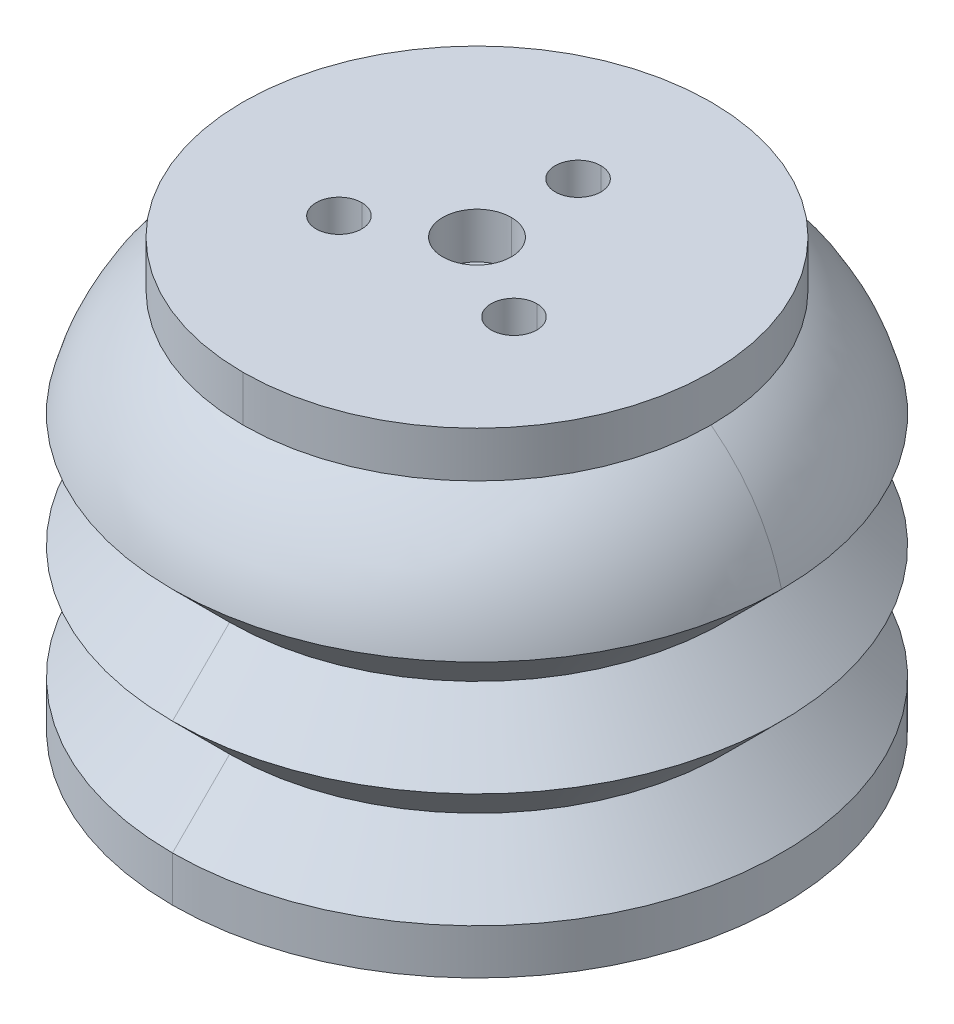
ISO-10303-21;
HEADER;
FILE_DESCRIPTION(('STEP AP214'),'2;1');
FILE_NAME('part.step','',(''),(''),'','','');
FILE_SCHEMA(('AUTOMOTIVE_DESIGN { 1 0 10303 214 1 1 1 1 }'));
ENDSEC;
DATA;
#1=APPLICATION_CONTEXT('core data for automotive mechanical design processes');
#2=APPLICATION_PROTOCOL_DEFINITION('international standard','automotive_design',2000,#1);
#3=PRODUCT_CONTEXT('',#1,'mechanical');
#4=PRODUCT('Part','Part','',(#3));
#5=PRODUCT_RELATED_PRODUCT_CATEGORY('part','',(#4));
#6=PRODUCT_DEFINITION_FORMATION('','',#4);
#7=PRODUCT_DEFINITION_CONTEXT('part definition',#1,'design');
#8=PRODUCT_DEFINITION('design','',#6,#7);
#9=PRODUCT_DEFINITION_SHAPE('','',#8);
#10=(LENGTH_UNIT() NAMED_UNIT(*) SI_UNIT(.MILLI.,.METRE.));
#11=(NAMED_UNIT(*) PLANE_ANGLE_UNIT() SI_UNIT($,.RADIAN.));
#12=(NAMED_UNIT(*) SI_UNIT($,.STERADIAN.) SOLID_ANGLE_UNIT());
#13=UNCERTAINTY_MEASURE_WITH_UNIT(LENGTH_MEASURE(1.E-05),#10,'distance_accuracy_value','');
#14=(GEOMETRIC_REPRESENTATION_CONTEXT(3) GLOBAL_UNCERTAINTY_ASSIGNED_CONTEXT((#13)) GLOBAL_UNIT_ASSIGNED_CONTEXT((#10,
#11,#12)) REPRESENTATION_CONTEXT('',''));
#15=CARTESIAN_POINT('',(0.,0.,0.));
#16=DIRECTION('',(0.,0.,1.));
#17=DIRECTION('',(1.,0.,0.));
#18=AXIS2_PLACEMENT_3D('',#15,#16,#17);
#19=CARTESIAN_POINT('',(0.,-35.5636864098736,-8.85));
#20=DIRECTION('',(0.,1.,0.));
#21=DIRECTION('',(0.,0.,1.));
#22=AXIS2_PLACEMENT_3D('',#19,#20,#21);
#23=CYLINDRICAL_SURFACE('',#22,2.);
#24=DIRECTION('',(0.,1.,0.));
#25=VECTOR('',#24,1.);
#26=CARTESIAN_POINT('',(0.,-35.5636864098736,-10.85));
#27=LINE('',#26,#25);
#28=CARTESIAN_POINT('',(0.,-35.5636864098736,-10.85));
#29=VERTEX_POINT('',#28);
#30=CARTESIAN_POINT('',(0.,-31.5636864098736,-10.85));
#31=VERTEX_POINT('',#30);
#32=EDGE_CURVE('E501',#29,#31,#27,.T.);
#33=ORIENTED_EDGE('',*,*,#32,.F.);
#34=CARTESIAN_POINT('',(0.,-35.5636864098736,-8.85));
#35=DIRECTION('',(0.,1.,0.));
#36=DIRECTION('',(0.,0.,1.));
#37=AXIS2_PLACEMENT_3D('',#34,#35,#36);
#38=CIRCLE('',#37,2.);
#39=CARTESIAN_POINT('',(0.,-35.5636864098736,-6.85));
#40=VERTEX_POINT('',#39);
#41=EDGE_CURVE('E259',#40,#29,#38,.T.);
#42=ORIENTED_EDGE('',*,*,#41,.F.);
#43=DIRECTION('',(0.,1.,0.));
#44=VECTOR('',#43,1.);
#45=CARTESIAN_POINT('',(0.,-35.5636864098736,-6.85));
#46=LINE('',#45,#44);
#47=CARTESIAN_POINT('',(0.,-31.5636864098736,-6.85));
#48=VERTEX_POINT('',#47);
#49=EDGE_CURVE('E434',#40,#48,#46,.T.);
#50=ORIENTED_EDGE('',*,*,#49,.T.);
#51=CARTESIAN_POINT('',(0.,-31.5636864098736,-8.85));
#52=DIRECTION('',(0.,1.,0.));
#53=DIRECTION('',(0.,0.,1.));
#54=AXIS2_PLACEMENT_3D('',#51,#52,#53);
#55=CIRCLE('',#54,2.);
#56=EDGE_CURVE('E265',#48,#31,#55,.T.);
#57=ORIENTED_EDGE('',*,*,#56,.T.);
#58=EDGE_LOOP('',(#33,#42,#50,#57));
#59=FACE_BOUND('',#58,.T.);
#60=ADVANCED_FACE('F16',(#59),#23,.F.);
#61=CARTESIAN_POINT('',(7.66432482349285,-35.5636864098736,4.42499999999967));
#62=DIRECTION('',(0.,1.,0.));
#63=DIRECTION('',(0.,0.,1.));
#64=AXIS2_PLACEMENT_3D('',#61,#62,#63);
#65=CYLINDRICAL_SURFACE('',#64,2.00000000000048);
#66=DIRECTION('',(0.,1.,0.));
#67=VECTOR('',#66,1.);
#68=CARTESIAN_POINT('',(7.66432482349285,-35.5636864098736,2.42499999999919));
#69=LINE('',#68,#67);
#70=CARTESIAN_POINT('',(7.66432482349285,-35.5636864098736,2.42499999999919));
#71=VERTEX_POINT('',#70);
#72=CARTESIAN_POINT('',(7.66432482349285,-31.5636864098736,2.42499999999919));
#73=VERTEX_POINT('',#72);
#74=EDGE_CURVE('E423',#71,#73,#69,.T.);
#75=ORIENTED_EDGE('',*,*,#74,.F.);
#76=CARTESIAN_POINT('',(7.66432482349285,-35.5636864098736,4.42499999999967));
#77=DIRECTION('',(0.,1.,0.));
#78=DIRECTION('',(0.,0.,1.));
#79=AXIS2_PLACEMENT_3D('',#76,#77,#78);
#80=CIRCLE('',#79,2.00000000000048);
#81=CARTESIAN_POINT('',(7.66432482349285,-35.5636864098736,6.42500000000016));
#82=VERTEX_POINT('',#81);
#83=EDGE_CURVE('E255',#82,#71,#80,.T.);
#84=ORIENTED_EDGE('',*,*,#83,.F.);
#85=DIRECTION('',(0.,1.,0.));
#86=VECTOR('',#85,1.);
#87=CARTESIAN_POINT('',(7.66432482349285,-35.5636864098736,6.42500000000016));
#88=LINE('',#87,#86);
#89=CARTESIAN_POINT('',(7.66432482349285,-31.5636864098736,6.42500000000016));
#90=VERTEX_POINT('',#89);
#91=EDGE_CURVE('E303',#82,#90,#88,.T.);
#92=ORIENTED_EDGE('',*,*,#91,.T.);
#93=CARTESIAN_POINT('',(7.66432482349285,-31.5636864098736,4.42499999999967));
#94=DIRECTION('',(0.,1.,0.));
#95=DIRECTION('',(0.,0.,1.));
#96=AXIS2_PLACEMENT_3D('',#93,#94,#95);
#97=CIRCLE('',#96,2.00000000000048);
#98=EDGE_CURVE('E268',#90,#73,#97,.T.);
#99=ORIENTED_EDGE('',*,*,#98,.T.);
#100=EDGE_LOOP('',(#75,#84,#92,#99));
#101=FACE_BOUND('',#100,.T.);
#102=ADVANCED_FACE('F581',(#101),#65,.F.);
#103=CARTESIAN_POINT('',(-7.66432482349172,-35.5636864098736,4.42500000000033));
#104=DIRECTION('',(0.,1.,0.));
#105=DIRECTION('',(0.,0.,1.));
#106=AXIS2_PLACEMENT_3D('',#103,#104,#105);
#107=CYLINDRICAL_SURFACE('',#106,2.00000000000071);
#108=DIRECTION('',(0.,1.,0.));
#109=VECTOR('',#108,1.);
#110=CARTESIAN_POINT('',(-7.66432482349172,-35.5636864098736,2.42499999999961));
#111=LINE('',#110,#109);
#112=CARTESIAN_POINT('',(-7.66432482349172,-35.5636864098736,2.42499999999961));
#113=VERTEX_POINT('',#112);
#114=CARTESIAN_POINT('',(-7.66432482349172,-31.5636864098736,2.42499999999961));
#115=VERTEX_POINT('',#114);
#116=EDGE_CURVE('E302',#113,#115,#111,.T.);
#117=ORIENTED_EDGE('',*,*,#116,.F.);
#118=CARTESIAN_POINT('',(-7.66432482349172,-35.5636864098736,4.42500000000033));
#119=DIRECTION('',(0.,1.,0.));
#120=DIRECTION('',(0.,0.,1.));
#121=AXIS2_PLACEMENT_3D('',#118,#119,#120);
#122=CIRCLE('',#121,2.00000000000071);
#123=CARTESIAN_POINT('',(-7.66432482349172,-35.5636864098736,6.42500000000105));
#124=VERTEX_POINT('',#123);
#125=EDGE_CURVE('E258',#124,#113,#122,.T.);
#126=ORIENTED_EDGE('',*,*,#125,.F.);
#127=DIRECTION('',(0.,1.,0.));
#128=VECTOR('',#127,1.);
#129=CARTESIAN_POINT('',(-7.66432482349172,-35.5636864098736,6.42500000000105));
#130=LINE('',#129,#128);
#131=CARTESIAN_POINT('',(-7.66432482349172,-31.5636864098736,6.42500000000105));
#132=VERTEX_POINT('',#131);
#133=EDGE_CURVE('E381',#124,#132,#130,.T.);
#134=ORIENTED_EDGE('',*,*,#133,.T.);
#135=CARTESIAN_POINT('',(-7.66432482349172,-31.5636864098736,4.42500000000033));
#136=DIRECTION('',(0.,1.,0.));
#137=DIRECTION('',(0.,0.,1.));
#138=AXIS2_PLACEMENT_3D('',#135,#136,#137);
#139=CIRCLE('',#138,2.00000000000071);
#140=EDGE_CURVE('E288',#132,#115,#139,.T.);
#141=ORIENTED_EDGE('',*,*,#140,.T.);
#142=EDGE_LOOP('',(#117,#126,#134,#141));
#143=FACE_BOUND('',#142,.T.);
#144=ADVANCED_FACE('F587',(#143),#107,.F.);
#145=CARTESIAN_POINT('',(0.,-59.9376784017915,0.));
#146=DIRECTION('',(0.,-1.,0.));
#147=DIRECTION('',(0.,0.,-1.));
#148=AXIS2_PLACEMENT_3D('',#145,#146,#147);
#149=CONICAL_SURFACE('',#148,17.7064120587923,0.785398163397449);
#150=DIRECTION('',(0.,-0.707106781186547,0.707106781186548));
#151=VECTOR('',#150,1.);
#152=CARTESIAN_POINT('',(0.,-59.9376784017915,17.7064120587923));
#153=LINE('',#152,#151);
#154=CARTESIAN_POINT('',(0.,-59.9376784017915,17.7064120587923));
#155=VERTEX_POINT('',#154);
#156=CARTESIAN_POINT('',(0.,-68.8974763764362,26.666210033437));
#157=VERTEX_POINT('',#156);
#158=EDGE_CURVE('E323',#155,#157,#153,.T.);
#159=ORIENTED_EDGE('',*,*,#158,.F.);
#160=CARTESIAN_POINT('',(0.,-59.9376784017915,0.));
#161=DIRECTION('',(0.,-1.,0.));
#162=DIRECTION('',(0.,0.,-1.));
#163=AXIS2_PLACEMENT_3D('',#160,#161,#162);
#164=CIRCLE('',#163,17.7064120587923);
#165=CARTESIAN_POINT('',(0.,-59.9376784017915,-17.7064120587923));
#166=VERTEX_POINT('',#165);
#167=EDGE_CURVE('E263',#166,#155,#164,.T.);
#168=ORIENTED_EDGE('',*,*,#167,.F.);
#169=DIRECTION('',(0.,-0.707106781186547,-0.707106781186548));
#170=VECTOR('',#169,1.);
#171=CARTESIAN_POINT('',(0.,-59.9376784017915,-17.7064120587923));
#172=LINE('',#171,#170);
#173=CARTESIAN_POINT('',(0.,-68.8974763764362,-26.666210033437));
#174=VERTEX_POINT('',#173);
#175=EDGE_CURVE('E322',#166,#174,#172,.T.);
#176=ORIENTED_EDGE('',*,*,#175,.T.);
#177=CARTESIAN_POINT('',(0.,-68.8974763764362,0.));
#178=DIRECTION('',(0.,-1.,0.));
#179=DIRECTION('',(0.,0.,-1.));
#180=AXIS2_PLACEMENT_3D('',#177,#178,#179);
#181=CIRCLE('',#180,26.666210033437);
#182=EDGE_CURVE('E249',#174,#157,#181,.T.);
#183=ORIENTED_EDGE('',*,*,#182,.T.);
#184=EDGE_LOOP('',(#159,#168,#176,#183));
#185=FACE_BOUND('',#184,.T.);
#186=ADVANCED_FACE('F597',(#185),#149,.F.);
#187=CARTESIAN_POINT('',(0.,-69.15521892846,0.));
#188=DIRECTION('',(0.,-1.,0.));
#189=DIRECTION('',(0.,0.,-1.));
#190=AXIS2_PLACEMENT_3D('',#187,#188,#189);
#191=CYLINDRICAL_SURFACE('',#190,26.666210033437);
#192=DIRECTION('',(0.,-1.,0.));
#193=VECTOR('',#192,1.);
#194=CARTESIAN_POINT('',(0.,-69.15521892846,26.666210033437));
#195=LINE('',#194,#193);
#196=CARTESIAN_POINT('',(0.,-64.9376784017917,26.666210033437));
#197=VERTEX_POINT('',#196);
#198=EDGE_CURVE('E251',#197,#157,#195,.T.);
#199=ORIENTED_EDGE('',*,*,#198,.F.);
#200=CARTESIAN_POINT('',(0.,-64.9376784017917,0.));
#201=DIRECTION('',(0.,-1.,0.));
#202=DIRECTION('',(0.,0.,-1.));
#203=AXIS2_PLACEMENT_3D('',#200,#201,#202);
#204=CIRCLE('',#203,26.666210033437);
#205=CARTESIAN_POINT('',(0.,-64.9376784017917,-26.666210033437));
#206=VERTEX_POINT('',#205);
#207=EDGE_CURVE('E11',#197,#206,#204,.T.);
#208=ORIENTED_EDGE('',*,*,#207,.T.);
#209=DIRECTION('',(0.,-1.,0.));
#210=VECTOR('',#209,1.);
#211=CARTESIAN_POINT('',(0.,-69.15521892846,-26.666210033437));
#212=LINE('',#211,#210);
#213=EDGE_CURVE('E250',#206,#174,#212,.T.);
#214=ORIENTED_EDGE('',*,*,#213,.T.);
#215=CARTESIAN_POINT('',(0.,-68.8974763764362,0.));
#216=DIRECTION('',(0.,-1.,0.));
#217=DIRECTION('',(0.,0.,-1.));
#218=AXIS2_PLACEMENT_3D('',#215,#216,#217);
#219=CIRCLE('',#218,26.666210033437);
#220=EDGE_CURVE('E315',#157,#174,#219,.T.);
#221=ORIENTED_EDGE('',*,*,#220,.F.);
#222=EDGE_LOOP('',(#199,#208,#214,#221));
#223=FACE_BOUND('',#222,.T.);
#224=ADVANCED_FACE('F606',(#223),#191,.T.);
#225=CARTESIAN_POINT('',(0.,-59.9376784017916,0.));
#226=DIRECTION('',(0.,-1.,0.));
#227=DIRECTION('',(0.,0.,-1.));
#228=AXIS2_PLACEMENT_3D('',#225,#226,#227);
#229=CONICAL_SURFACE('',#228,21.666210033437,0.785398163397432);
#230=DIRECTION('',(0.,-0.707106781186559,0.707106781186536));
#231=VECTOR('',#230,1.);
#232=CARTESIAN_POINT('',(0.,-59.9376784017916,21.666210033437));
#233=LINE('',#232,#231);
#234=CARTESIAN_POINT('',(0.,-59.9376784017916,21.666210033437));
#235=VERTEX_POINT('',#234);
#236=EDGE_CURVE('E373',#235,#197,#233,.T.);
#237=ORIENTED_EDGE('',*,*,#236,.F.);
#238=CARTESIAN_POINT('',(0.,-59.9376784017916,0.));
#239=DIRECTION('',(0.,-1.,0.));
#240=DIRECTION('',(0.,0.,-1.));
#241=AXIS2_PLACEMENT_3D('',#238,#239,#240);
#242=CIRCLE('',#241,21.666210033437);
#243=CARTESIAN_POINT('',(0.,-59.9376784017916,-21.666210033437));
#244=VERTEX_POINT('',#243);
#245=EDGE_CURVE('E29',#235,#244,#242,.T.);
#246=ORIENTED_EDGE('',*,*,#245,.T.);
#247=DIRECTION('',(0.,-0.707106781186559,-0.707106781186536));
#248=VECTOR('',#247,1.);
#249=CARTESIAN_POINT('',(0.,-59.9376784017916,-21.666210033437));
#250=LINE('',#249,#248);
#251=EDGE_CURVE('E377',#244,#206,#250,.T.);
#252=ORIENTED_EDGE('',*,*,#251,.T.);
#253=ORIENTED_EDGE('',*,*,#207,.F.);
#254=EDGE_LOOP('',(#237,#246,#252,#253));
#255=FACE_BOUND('',#254,.T.);
#256=ADVANCED_FACE('F611',(#255),#229,.T.);
#257=CARTESIAN_POINT('',(0.,-54.9376784017916,0.));
#258=DIRECTION('',(0.,1.,0.));
#259=DIRECTION('',(0.,0.,1.));
#260=AXIS2_PLACEMENT_3D('',#257,#258,#259);
#261=CONICAL_SURFACE('',#260,26.666210033437,0.785398163397453);
#262=DIRECTION('',(0.,0.707106781186544,-0.707106781186551));
#263=VECTOR('',#262,1.);
#264=CARTESIAN_POINT('',(0.,-54.9376784017916,-26.666210033437));
#265=LINE('',#264,#263);
#266=CARTESIAN_POINT('',(0.,-54.9376784017916,-26.666210033437));
#267=VERTEX_POINT('',#266);
#268=EDGE_CURVE('E464',#244,#267,#265,.T.);
#269=ORIENTED_EDGE('',*,*,#268,.F.);
#270=ORIENTED_EDGE('',*,*,#245,.F.);
#271=DIRECTION('',(0.,0.707106781186544,0.707106781186551));
#272=VECTOR('',#271,1.);
#273=CARTESIAN_POINT('',(0.,-54.9376784017916,26.666210033437));
#274=LINE('',#273,#272);
#275=CARTESIAN_POINT('',(0.,-54.9376784017916,26.666210033437));
#276=VERTEX_POINT('',#275);
#277=EDGE_CURVE('E236',#235,#276,#274,.T.);
#278=ORIENTED_EDGE('',*,*,#277,.T.);
#279=CARTESIAN_POINT('',(0.,-54.9376784017916,0.));
#280=DIRECTION('',(0.,-1.,0.));
#281=DIRECTION('',(0.,0.,-1.));
#282=AXIS2_PLACEMENT_3D('',#279,#280,#281);
#283=CIRCLE('',#282,26.666210033437);
#284=EDGE_CURVE('E212',#276,#267,#283,.T.);
#285=ORIENTED_EDGE('',*,*,#284,.T.);
#286=EDGE_LOOP('',(#269,#270,#278,#285));
#287=FACE_BOUND('',#286,.T.);
#288=ADVANCED_FACE('F608',(#287),#261,.T.);
#289=CARTESIAN_POINT('',(0.,-49.9376784017916,0.));
#290=DIRECTION('',(0.,-1.,0.));
#291=DIRECTION('',(0.,0.,-1.));
#292=AXIS2_PLACEMENT_3D('',#289,#290,#291);
#293=CONICAL_SURFACE('',#292,21.666210033437,0.785398163397446);
#294=DIRECTION('',(0.,-0.707106781186549,0.707106781186546));
#295=VECTOR('',#294,1.);
#296=CARTESIAN_POINT('',(0.,-49.9376784017916,21.666210033437));
#297=LINE('',#296,#295);
#298=CARTESIAN_POINT('',(0.,-49.9376784017916,21.666210033437));
#299=VERTEX_POINT('',#298);
#300=EDGE_CURVE('E226',#299,#276,#297,.T.);
#301=ORIENTED_EDGE('',*,*,#300,.F.);
#302=CARTESIAN_POINT('',(0.,-49.9376784017916,0.));
#303=DIRECTION('',(0.,-1.,0.));
#304=DIRECTION('',(0.,0.,-1.));
#305=AXIS2_PLACEMENT_3D('',#302,#303,#304);
#306=CIRCLE('',#305,21.666210033437);
#307=CARTESIAN_POINT('',(0.,-49.9376784017916,-21.666210033437));
#308=VERTEX_POINT('',#307);
#309=EDGE_CURVE('E199',#299,#308,#306,.T.);
#310=ORIENTED_EDGE('',*,*,#309,.T.);
#311=DIRECTION('',(0.,-0.707106781186549,-0.707106781186546));
#312=VECTOR('',#311,1.);
#313=CARTESIAN_POINT('',(0.,-49.9376784017916,-21.666210033437));
#314=LINE('',#313,#312);
#315=EDGE_CURVE('E232',#308,#267,#314,.T.);
#316=ORIENTED_EDGE('',*,*,#315,.T.);
#317=ORIENTED_EDGE('',*,*,#284,.F.);
#318=EDGE_LOOP('',(#301,#310,#316,#317));
#319=FACE_BOUND('',#318,.T.);
#320=ADVANCED_FACE('F227',(#319),#293,.T.);
#321=CARTESIAN_POINT('',(0.,-44.9376784017916,0.));
#322=DIRECTION('',(0.,1.,0.));
#323=DIRECTION('',(0.,0.,1.));
#324=AXIS2_PLACEMENT_3D('',#321,#322,#323);
#325=CONICAL_SURFACE('',#324,26.666210033437,0.785398163397453);
#326=DIRECTION('',(0.,0.707106781186544,-0.707106781186551));
#327=VECTOR('',#326,1.);
#328=CARTESIAN_POINT('',(0.,-44.9376784017916,-26.666210033437));
#329=LINE('',#328,#327);
#330=CARTESIAN_POINT('',(0.,-44.9376784017916,-26.666210033437));
#331=VERTEX_POINT('',#330);
#332=EDGE_CURVE('E206',#308,#331,#329,.T.);
#333=ORIENTED_EDGE('',*,*,#332,.F.);
#334=ORIENTED_EDGE('',*,*,#309,.F.);
#335=DIRECTION('',(0.,0.707106781186544,0.707106781186551));
#336=VECTOR('',#335,1.);
#337=CARTESIAN_POINT('',(0.,-44.9376784017916,26.666210033437));
#338=LINE('',#337,#336);
#339=CARTESIAN_POINT('',(0.,-44.9376784017916,26.666210033437));
#340=VERTEX_POINT('',#339);
#341=EDGE_CURVE('E203',#299,#340,#338,.T.);
#342=ORIENTED_EDGE('',*,*,#341,.T.);
#343=CARTESIAN_POINT('',(0.,-44.9376784017916,0.));
#344=DIRECTION('',(0.,-1.,0.));
#345=DIRECTION('',(0.,0.,-1.));
#346=AXIS2_PLACEMENT_3D('',#343,#344,#345);
#347=CIRCLE('',#346,26.666210033437);
#348=CARTESIAN_POINT('',(-26.666210033437,-44.9376784017916,0.));
#349=VERTEX_POINT('',#348);
#350=EDGE_CURVE('E213',#340,#349,#347,.T.);
#351=ORIENTED_EDGE('',*,*,#350,.T.);
#352=CARTESIAN_POINT('',(0.,-44.9376784017916,0.));
#353=DIRECTION('',(0.,-1.,0.));
#354=DIRECTION('',(0.,0.,-1.));
#355=AXIS2_PLACEMENT_3D('',#352,#353,#354);
#356=CIRCLE('',#355,26.666210033437);
#357=EDGE_CURVE('E351',#349,#331,#356,.T.);
#358=ORIENTED_EDGE('',*,*,#357,.T.);
#359=EDGE_LOOP('',(#333,#334,#342,#351,#358));
#360=FACE_BOUND('',#359,.T.);
#361=ADVANCED_FACE('F201',(#360),#325,.T.);
#362=CARTESIAN_POINT('',(20.5,-35.5636864098736,0.));
#363=CARTESIAN_POINT('',(20.5,-35.5636864098735,41.));
#364=CARTESIAN_POINT('',(-20.5,-35.5636864098735,41.));
#365=CARTESIAN_POINT('',(-20.5,-35.5636864098736,0.));
#366=CARTESIAN_POINT('',(25.2301295501218,-39.1638632300695,0.));
#367=CARTESIAN_POINT('',(25.2301295501217,-39.1638632300695,50.4602591002434));
#368=CARTESIAN_POINT('',(-25.2301295501217,-39.1638632300695,50.4602591002434));
#369=CARTESIAN_POINT('',(-25.2301295501218,-39.1638632300695,0.));
#370=CARTESIAN_POINT('',(26.666210033437,-44.9376784017916,0.));
#371=CARTESIAN_POINT('',(26.666210033437,-44.9376784017915,53.3324200668741));
#372=CARTESIAN_POINT('',(-26.666210033437,-44.9376784017915,53.3324200668741));
#373=CARTESIAN_POINT('',(-26.666210033437,-44.9376784017916,0.));
#374=(BOUNDED_SURFACE() B_SPLINE_SURFACE(2,3,((#362,#363,#364,#365),(#366,#367,#368,#369),(#370,
#371,#372,#373)),.UNSPECIFIED.,.F.,.F.,.F.) B_SPLINE_SURFACE_WITH_KNOTS((3,3),(4,4),(0.,1.),(0.,
1.),.UNSPECIFIED.) GEOMETRIC_REPRESENTATION_ITEM() RATIONAL_B_SPLINE_SURFACE(((1.,
0.333333333333334,0.333333333333334,1.),(1.,0.333333333333334,0.333333333333334,1.),(1.,
0.333333333333334,0.333333333333334,1.))) REPRESENTATION_ITEM('') SURFACE());
#375=CARTESIAN_POINT('',(20.5,-35.5636864098736,0.));
#376=CARTESIAN_POINT('',(25.2301295501218,-39.1638632300695,0.));
#377=CARTESIAN_POINT('',(26.666210033437,-44.9376784017916,0.));
#378=(BOUNDED_CURVE() B_SPLINE_CURVE(2,(#375,#376,#377),.UNSPECIFIED.,.F.,
.F.) B_SPLINE_CURVE_WITH_KNOTS((3,3),(0.,1.),
.UNSPECIFIED.) CURVE() GEOMETRIC_REPRESENTATION_ITEM() RATIONAL_B_SPLINE_CURVE((1.,1.,1.)) REPRESENTATION_ITEM(''));
#379=CARTESIAN_POINT('',(20.5,-35.5636864098736,0.));
#380=VERTEX_POINT('',#379);
#381=CARTESIAN_POINT('',(26.666210033437,-44.9376784017916,0.));
#382=VERTEX_POINT('',#381);
#383=EDGE_CURVE('E274',#380,#382,#378,.T.);
#384=CARTESIAN_POINT('',(0.,-35.5636864098736,0.));
#385=DIRECTION('',(0.,-1.,0.));
#386=DIRECTION('',(0.,0.,-1.));
#387=AXIS2_PLACEMENT_3D('',#384,#385,#386);
#388=CIRCLE('',#387,20.5);
#389=CARTESIAN_POINT('',(0.,-35.5636864098736,20.5));
#390=VERTEX_POINT('',#389);
#391=EDGE_CURVE('E293',#380,#390,#388,.T.);
#392=CARTESIAN_POINT('',(0.,-35.5636864098736,0.));
#393=DIRECTION('',(0.,-1.,0.));
#394=DIRECTION('',(0.,0.,-1.));
#395=AXIS2_PLACEMENT_3D('',#392,#393,#394);
#396=CIRCLE('',#395,20.5);
#397=CARTESIAN_POINT('',(-20.5,-35.5636864098736,0.));
#398=VERTEX_POINT('',#397);
#399=EDGE_CURVE('E282',#390,#398,#396,.T.);
#400=CARTESIAN_POINT('',(-20.5,-35.5636864098736,0.));
#401=CARTESIAN_POINT('',(-25.2301295501218,-39.1638632300695,0.));
#402=CARTESIAN_POINT('',(-26.666210033437,-44.9376784017916,0.));
#403=(BOUNDED_CURVE() B_SPLINE_CURVE(2,(#400,#401,#402),.UNSPECIFIED.,.F.,
.F.) B_SPLINE_CURVE_WITH_KNOTS((3,3),(0.,1.),
.UNSPECIFIED.) CURVE() GEOMETRIC_REPRESENTATION_ITEM() RATIONAL_B_SPLINE_CURVE((1.,1.,1.)) REPRESENTATION_ITEM(''));
#404=EDGE_CURVE('E344',#398,#349,#403,.T.);
#405=CARTESIAN_POINT('',(0.,-44.9376784017916,0.));
#406=DIRECTION('',(0.,-1.,0.));
#407=DIRECTION('',(0.,0.,-1.));
#408=AXIS2_PLACEMENT_3D('',#405,#406,#407);
#409=CIRCLE('',#408,26.666210033437);
#410=EDGE_CURVE('E221',#382,#340,#409,.T.);
#411=ORIENTED_EDGE('',*,*,#383,.F.);
#412=ORIENTED_EDGE('',*,*,#391,.T.);
#413=ORIENTED_EDGE('',*,*,#399,.T.);
#414=ORIENTED_EDGE('',*,*,#404,.T.);
#415=ORIENTED_EDGE('',*,*,#350,.F.);
#416=ORIENTED_EDGE('',*,*,#410,.F.);
#417=EDGE_LOOP('',(#411,#412,#413,#414,#415,#416));
#418=FACE_BOUND('',#417,.T.);
#419=ADVANCED_FACE('F18',(#418),#374,.F.);
#420=CARTESIAN_POINT('',(0.,-69.15521892846,0.));
#421=DIRECTION('',(0.,-1.,0.));
#422=DIRECTION('',(0.,0.,-1.));
#423=AXIS2_PLACEMENT_3D('',#420,#421,#422);
#424=CYLINDRICAL_SURFACE('',#423,20.5);
#425=DIRECTION('',(0.,-1.,0.));
#426=VECTOR('',#425,1.);
#427=CARTESIAN_POINT('',(0.,-69.15521892846,20.5));
#428=LINE('',#427,#426);
#429=CARTESIAN_POINT('',(0.,-31.5636864098736,20.5));
#430=VERTEX_POINT('',#429);
#431=EDGE_CURVE('E289',#430,#390,#428,.T.);
#432=ORIENTED_EDGE('',*,*,#431,.F.);
#433=CARTESIAN_POINT('',(0.,-31.5636864098736,0.));
#434=DIRECTION('',(0.,-1.,0.));
#435=DIRECTION('',(0.,0.,-1.));
#436=AXIS2_PLACEMENT_3D('',#433,#434,#435);
#437=CIRCLE('',#436,20.5);
#438=CARTESIAN_POINT('',(0.,-31.5636864098736,-20.5));
#439=VERTEX_POINT('',#438);
#440=EDGE_CURVE('E269',#430,#439,#437,.T.);
#441=ORIENTED_EDGE('',*,*,#440,.T.);
#442=DIRECTION('',(0.,-1.,0.));
#443=VECTOR('',#442,1.);
#444=CARTESIAN_POINT('',(0.,-69.15521892846,-20.5));
#445=LINE('',#444,#443);
#446=CARTESIAN_POINT('',(0.,-35.5636864098736,-20.5));
#447=VERTEX_POINT('',#446);
#448=EDGE_CURVE('E307',#439,#447,#445,.T.);
#449=ORIENTED_EDGE('',*,*,#448,.T.);
#450=CARTESIAN_POINT('',(0.,-35.5636864098736,0.));
#451=DIRECTION('',(0.,-1.,0.));
#452=DIRECTION('',(0.,0.,-1.));
#453=AXIS2_PLACEMENT_3D('',#450,#451,#452);
#454=CIRCLE('',#453,20.5);
#455=EDGE_CURVE('E350',#398,#447,#454,.T.);
#456=ORIENTED_EDGE('',*,*,#455,.F.);
#457=ORIENTED_EDGE('',*,*,#399,.F.);
#458=EDGE_LOOP('',(#432,#441,#449,#456,#457));
#459=FACE_BOUND('',#458,.T.);
#460=ADVANCED_FACE('F593',(#459),#424,.T.);
#461=CARTESIAN_POINT('',(0.,-31.5636864098736,0.));
#462=DIRECTION('',(0.,1.,0.));
#463=DIRECTION('',(1.,0.,0.));
#464=AXIS2_PLACEMENT_3D('',#461,#462,#463);
#465=PLANE('',#464);
#466=CARTESIAN_POINT('',(0.,-31.5636864098736,0.));
#467=DIRECTION('',(0.,-1.,0.));
#468=DIRECTION('',(0.,0.,-1.));
#469=AXIS2_PLACEMENT_3D('',#466,#467,#468);
#470=CIRCLE('',#469,3.);
#471=CARTESIAN_POINT('',(0.,-31.5636864098736,-3.));
#472=VERTEX_POINT('',#471);
#473=CARTESIAN_POINT('',(0.,-31.5636864098736,3.));
#474=VERTEX_POINT('',#473);
#475=EDGE_CURVE('E364',#472,#474,#470,.T.);
#476=ORIENTED_EDGE('',*,*,#475,.T.);
#477=CARTESIAN_POINT('',(0.,-31.5636864098736,0.));
#478=DIRECTION('',(0.,-1.,0.));
#479=DIRECTION('',(0.,0.,-1.));
#480=AXIS2_PLACEMENT_3D('',#477,#478,#479);
#481=CIRCLE('',#480,3.);
#482=EDGE_CURVE('E435',#474,#472,#481,.T.);
#483=ORIENTED_EDGE('',*,*,#482,.T.);
#484=EDGE_LOOP('',(#476,#483));
#485=FACE_BOUND('',#484,.T.);
#486=ORIENTED_EDGE('',*,*,#140,.F.);
#487=CARTESIAN_POINT('',(-7.66432482349172,-31.5636864098736,4.42500000000033));
#488=DIRECTION('',(0.,1.,0.));
#489=DIRECTION('',(0.,0.,1.));
#490=AXIS2_PLACEMENT_3D('',#487,#488,#489);
#491=CIRCLE('',#490,2.00000000000071);
#492=EDGE_CURVE('E358',#115,#132,#491,.T.);
#493=ORIENTED_EDGE('',*,*,#492,.F.);
#494=EDGE_LOOP('',(#486,#493));
#495=FACE_BOUND('',#494,.T.);
#496=ORIENTED_EDGE('',*,*,#98,.F.);
#497=CARTESIAN_POINT('',(7.66432482349285,-31.5636864098736,4.42499999999967));
#498=DIRECTION('',(0.,1.,0.));
#499=DIRECTION('',(0.,0.,1.));
#500=AXIS2_PLACEMENT_3D('',#497,#498,#499);
#501=CIRCLE('',#500,2.00000000000048);
#502=EDGE_CURVE('E419',#73,#90,#501,.T.);
#503=ORIENTED_EDGE('',*,*,#502,.F.);
#504=EDGE_LOOP('',(#496,#503));
#505=FACE_BOUND('',#504,.T.);
#506=ORIENTED_EDGE('',*,*,#56,.F.);
#507=CARTESIAN_POINT('',(0.,-31.5636864098736,-8.85));
#508=DIRECTION('',(0.,1.,0.));
#509=DIRECTION('',(0.,0.,1.));
#510=AXIS2_PLACEMENT_3D('',#507,#508,#509);
#511=CIRCLE('',#510,2.);
#512=EDGE_CURVE('E505',#31,#48,#511,.T.);
#513=ORIENTED_EDGE('',*,*,#512,.F.);
#514=EDGE_LOOP('',(#506,#513));
#515=FACE_BOUND('',#514,.T.);
#516=CARTESIAN_POINT('',(0.,-31.5636864098736,0.));
#517=DIRECTION('',(0.,-1.,0.));
#518=DIRECTION('',(0.,0.,-1.));
#519=AXIS2_PLACEMENT_3D('',#516,#517,#518);
#520=CIRCLE('',#519,20.5);
#521=EDGE_CURVE('E223',#439,#430,#520,.T.);
#522=ORIENTED_EDGE('',*,*,#521,.F.);
#523=ORIENTED_EDGE('',*,*,#440,.F.);
#524=EDGE_LOOP('',(#522,#523));
#525=FACE_BOUND('',#524,.T.);
#526=ADVANCED_FACE('F574',(#485,#495,#505,#515,#525),#465,.T.);
#527=CARTESIAN_POINT('',(0.,-69.15521892846,0.));
#528=DIRECTION('',(0.,-1.,0.));
#529=DIRECTION('',(0.,0.,-1.));
#530=AXIS2_PLACEMENT_3D('',#527,#528,#529);
#531=CYLINDRICAL_SURFACE('',#530,3.);
#532=DIRECTION('',(0.,-1.,0.));
#533=VECTOR('',#532,1.);
#534=CARTESIAN_POINT('',(0.,-69.15521892846,3.));
#535=LINE('',#534,#533);
#536=CARTESIAN_POINT('',(0.,-35.5636864098736,3.));
#537=VERTEX_POINT('',#536);
#538=EDGE_CURVE('E329',#474,#537,#535,.T.);
#539=ORIENTED_EDGE('',*,*,#538,.F.);
#540=ORIENTED_EDGE('',*,*,#475,.F.);
#541=DIRECTION('',(0.,-1.,0.));
#542=VECTOR('',#541,1.);
#543=CARTESIAN_POINT('',(0.,-69.15521892846,-3.));
#544=LINE('',#543,#542);
#545=CARTESIAN_POINT('',(0.,-35.5636864098736,-3.));
#546=VERTEX_POINT('',#545);
#547=EDGE_CURVE('E328',#472,#546,#544,.T.);
#548=ORIENTED_EDGE('',*,*,#547,.T.);
#549=CARTESIAN_POINT('',(0.,-35.5636864098736,0.));
#550=DIRECTION('',(0.,-1.,0.));
#551=DIRECTION('',(0.,0.,-1.));
#552=AXIS2_PLACEMENT_3D('',#549,#550,#551);
#553=CIRCLE('',#552,3.);
#554=EDGE_CURVE('E297',#546,#537,#553,.T.);
#555=ORIENTED_EDGE('',*,*,#554,.T.);
#556=EDGE_LOOP('',(#539,#540,#548,#555));
#557=FACE_BOUND('',#556,.T.);
#558=ADVANCED_FACE('F566',(#557),#531,.F.);
#559=CARTESIAN_POINT('',(0.,-35.5636864098736,0.));
#560=DIRECTION('',(0.,-1.,0.));
#561=DIRECTION('',(0.,0.,-1.));
#562=AXIS2_PLACEMENT_3D('',#559,#560,#561);
#563=PLANE('',#562);
#564=ORIENTED_EDGE('',*,*,#554,.F.);
#565=CARTESIAN_POINT('',(0.,-35.5636864098736,0.));
#566=DIRECTION('',(0.,-1.,0.));
#567=DIRECTION('',(0.,0.,-1.));
#568=AXIS2_PLACEMENT_3D('',#565,#566,#567);
#569=CIRCLE('',#568,3.);
#570=EDGE_CURVE('E324',#537,#546,#569,.T.);
#571=ORIENTED_EDGE('',*,*,#570,.F.);
#572=EDGE_LOOP('',(#564,#571));
#573=FACE_BOUND('',#572,.T.);
#574=ORIENTED_EDGE('',*,*,#125,.T.);
#575=CARTESIAN_POINT('',(-7.66432482349172,-35.5636864098736,4.42500000000033));
#576=DIRECTION('',(0.,1.,0.));
#577=DIRECTION('',(0.,0.,1.));
#578=AXIS2_PLACEMENT_3D('',#575,#576,#577);
#579=CIRCLE('',#578,2.00000000000071);
#580=EDGE_CURVE('E298',#113,#124,#579,.T.);
#581=ORIENTED_EDGE('',*,*,#580,.T.);
#582=EDGE_LOOP('',(#574,#581));
#583=FACE_BOUND('',#582,.T.);
#584=ORIENTED_EDGE('',*,*,#83,.T.);
#585=CARTESIAN_POINT('',(7.66432482349285,-35.5636864098736,4.42499999999967));
#586=DIRECTION('',(0.,1.,0.));
#587=DIRECTION('',(0.,0.,1.));
#588=AXIS2_PLACEMENT_3D('',#585,#586,#587);
#589=CIRCLE('',#588,2.00000000000048);
#590=EDGE_CURVE('E430',#71,#82,#589,.T.);
#591=ORIENTED_EDGE('',*,*,#590,.T.);
#592=EDGE_LOOP('',(#584,#591));
#593=FACE_BOUND('',#592,.T.);
#594=ORIENTED_EDGE('',*,*,#41,.T.);
#595=CARTESIAN_POINT('',(0.,-35.5636864098736,-8.85));
#596=DIRECTION('',(0.,1.,0.));
#597=DIRECTION('',(0.,0.,1.));
#598=AXIS2_PLACEMENT_3D('',#595,#596,#597);
#599=CIRCLE('',#598,2.);
#600=EDGE_CURVE('E247',#29,#40,#599,.T.);
#601=ORIENTED_EDGE('',*,*,#600,.T.);
#602=EDGE_LOOP('',(#594,#601));
#603=FACE_BOUND('',#602,.T.);
#604=CARTESIAN_POINT('',(0.,-35.5636864098736,0.));
#605=DIRECTION('',(0.,-1.,0.));
#606=DIRECTION('',(0.,0.,-1.));
#607=AXIS2_PLACEMENT_3D('',#604,#605,#606);
#608=CIRCLE('',#607,16.4645709628566);
#609=CARTESIAN_POINT('',(-16.4645709628566,-35.5636864098736,0.));
#610=VERTEX_POINT('',#609);
#611=CARTESIAN_POINT('',(16.4645709628566,-35.5636864098736,0.));
#612=VERTEX_POINT('',#611);
#613=EDGE_CURVE('E429',#610,#612,#608,.T.);
#614=ORIENTED_EDGE('',*,*,#613,.T.);
#615=CARTESIAN_POINT('',(0.,-35.5636864098736,0.));
#616=DIRECTION('',(0.,-1.,0.));
#617=DIRECTION('',(0.,0.,-1.));
#618=AXIS2_PLACEMENT_3D('',#615,#616,#617);
#619=CIRCLE('',#618,16.4645709628566);
#620=EDGE_CURVE('E369',#612,#610,#619,.T.);
#621=ORIENTED_EDGE('',*,*,#620,.T.);
#622=EDGE_LOOP('',(#614,#621));
#623=FACE_BOUND('',#622,.T.);
#624=ADVANCED_FACE('F564',(#573,#583,#593,#603,#623),#563,.T.);
#625=CARTESIAN_POINT('',(-16.4645709628566,-35.5636864098736,0.));
#626=CARTESIAN_POINT('',(-16.4645709628566,-35.5636864098735,-32.9291419257132));
#627=CARTESIAN_POINT('',(16.4645709628566,-35.5636864098735,-32.9291419257132));
#628=CARTESIAN_POINT('',(16.4645709628566,-35.5636864098736,0.));
#629=CARTESIAN_POINT('',(-22.1752165043009,-40.1029642685698,0.));
#630=CARTESIAN_POINT('',(-22.1752165043008,-40.1029642685698,-44.3504330086017));
#631=CARTESIAN_POINT('',(22.1752165043008,-40.1029642685698,-44.3504330086017));
#632=CARTESIAN_POINT('',(22.1752165043009,-40.1029642685698,0.));
#633=CARTESIAN_POINT('',(-21.0402020253554,-46.603888435229,0.));
#634=CARTESIAN_POINT('',(-21.0402020253553,-46.6038884352289,-42.0804040507107));
#635=CARTESIAN_POINT('',(21.0402020253553,-46.6038884352289,-42.0804040507107));
#636=CARTESIAN_POINT('',(21.0402020253554,-46.603888435229,0.));
#637=(BOUNDED_SURFACE() B_SPLINE_SURFACE(2,3,((#625,#626,#627,#628),(#629,#630,#631,#632),(#633,
#634,#635,#636)),.UNSPECIFIED.,.F.,.F.,.F.) B_SPLINE_SURFACE_WITH_KNOTS((3,3),(4,4),(0.,1.),(0.,
1.),.UNSPECIFIED.) GEOMETRIC_REPRESENTATION_ITEM() RATIONAL_B_SPLINE_SURFACE(((1.,
0.333333333333334,0.333333333333334,1.),(1.,0.333333333333334,0.333333333333334,1.),(1.,
0.333333333333334,0.333333333333334,1.))) REPRESENTATION_ITEM('') SURFACE());
#638=CARTESIAN_POINT('',(16.4645709628566,-35.5636864098736,0.));
#639=CARTESIAN_POINT('',(22.1752165043009,-40.1029642685698,0.));
#640=CARTESIAN_POINT('',(21.0402020253554,-46.603888435229,0.));
#641=(BOUNDED_CURVE() B_SPLINE_CURVE(2,(#638,#639,#640),.UNSPECIFIED.,.F.,
.F.) B_SPLINE_CURVE_WITH_KNOTS((3,3),(0.,1.),
.UNSPECIFIED.) CURVE() GEOMETRIC_REPRESENTATION_ITEM() RATIONAL_B_SPLINE_CURVE((1.,1.,1.)) REPRESENTATION_ITEM(''));
#642=CARTESIAN_POINT('',(21.0402020253554,-46.603888435229,0.));
#643=VERTEX_POINT('',#642);
#644=EDGE_CURVE('E334',#612,#643,#641,.T.);
#645=CARTESIAN_POINT('',(-16.4645709628566,-35.5636864098736,0.));
#646=CARTESIAN_POINT('',(-22.1752165043009,-40.1029642685698,0.));
#647=CARTESIAN_POINT('',(-21.0402020253554,-46.603888435229,0.));
#648=(BOUNDED_CURVE() B_SPLINE_CURVE(2,(#645,#646,#647),.UNSPECIFIED.,.F.,
.F.) B_SPLINE_CURVE_WITH_KNOTS((3,3),(0.,1.),
.UNSPECIFIED.) CURVE() GEOMETRIC_REPRESENTATION_ITEM() RATIONAL_B_SPLINE_CURVE((1.,1.,1.)) REPRESENTATION_ITEM(''));
#649=CARTESIAN_POINT('',(-21.0402020253554,-46.603888435229,0.));
#650=VERTEX_POINT('',#649);
#651=EDGE_CURVE('E308',#610,#650,#648,.T.);
#652=CARTESIAN_POINT('',(0.,-46.603888435229,0.));
#653=DIRECTION('',(0.,-1.,0.));
#654=DIRECTION('',(0.,0.,-1.));
#655=AXIS2_PLACEMENT_3D('',#652,#653,#654);
#656=CIRCLE('',#655,21.0402020253554);
#657=CARTESIAN_POINT('',(0.,-46.603888435229,-21.0402020253554));
#658=VERTEX_POINT('',#657);
#659=EDGE_CURVE('E342',#650,#658,#656,.T.);
#660=CARTESIAN_POINT('',(0.,-46.603888435229,0.));
#661=DIRECTION('',(0.,-1.,0.));
#662=DIRECTION('',(0.,0.,-1.));
#663=AXIS2_PLACEMENT_3D('',#660,#661,#662);
#664=CIRCLE('',#663,21.0402020253554);
#665=EDGE_CURVE('E273',#658,#643,#664,.T.);
#666=ORIENTED_EDGE('',*,*,#644,.F.);
#667=ORIENTED_EDGE('',*,*,#613,.F.);
#668=ORIENTED_EDGE('',*,*,#651,.T.);
#669=ORIENTED_EDGE('',*,*,#659,.T.);
#670=ORIENTED_EDGE('',*,*,#665,.T.);
#671=EDGE_LOOP('',(#666,#667,#668,#669,#670));
#672=FACE_BOUND('',#671,.T.);
#673=ADVANCED_FACE('F549',(#672),#637,.T.);
#674=CARTESIAN_POINT('',(0.,-46.603888435229,0.));
#675=DIRECTION('',(0.,1.,0.));
#676=DIRECTION('',(0.,0.,1.));
#677=AXIS2_PLACEMENT_3D('',#674,#675,#676);
#678=CONICAL_SURFACE('',#677,21.0402020253554,0.785398163397513);
#679=DIRECTION('',(0.,0.707106781186502,-0.707106781186593));
#680=VECTOR('',#679,1.);
#681=CARTESIAN_POINT('',(0.,-46.603888435229,-21.0402020253554));
#682=LINE('',#681,#680);
#683=CARTESIAN_POINT('',(0.,-49.9376784017915,-17.7064120587923));
#684=VERTEX_POINT('',#683);
#685=EDGE_CURVE('E338',#684,#658,#682,.T.);
#686=ORIENTED_EDGE('',*,*,#685,.F.);
#687=CARTESIAN_POINT('',(0.,-49.9376784017915,0.));
#688=DIRECTION('',(0.,-1.,0.));
#689=DIRECTION('',(0.,0.,-1.));
#690=AXIS2_PLACEMENT_3D('',#687,#688,#689);
#691=CIRCLE('',#690,17.7064120587923);
#692=CARTESIAN_POINT('',(0.,-49.9376784017915,17.7064120587923));
#693=VERTEX_POINT('',#692);
#694=EDGE_CURVE('E270',#684,#693,#691,.T.);
#695=ORIENTED_EDGE('',*,*,#694,.T.);
#696=DIRECTION('',(0.,0.707106781186502,0.707106781186593));
#697=VECTOR('',#696,1.);
#698=CARTESIAN_POINT('',(0.,-46.603888435229,21.0402020253554));
#699=LINE('',#698,#697);
#700=CARTESIAN_POINT('',(0.,-46.603888435229,21.0402020253554));
#701=VERTEX_POINT('',#700);
#702=EDGE_CURVE('E450',#693,#701,#699,.T.);
#703=ORIENTED_EDGE('',*,*,#702,.T.);
#704=CARTESIAN_POINT('',(0.,-46.603888435229,0.));
#705=DIRECTION('',(0.,-1.,0.));
#706=DIRECTION('',(0.,0.,-1.));
#707=AXIS2_PLACEMENT_3D('',#704,#705,#706);
#708=CIRCLE('',#707,21.0402020253554);
#709=EDGE_CURVE('E330',#643,#701,#708,.T.);
#710=ORIENTED_EDGE('',*,*,#709,.F.);
#711=ORIENTED_EDGE('',*,*,#665,.F.);
#712=EDGE_LOOP('',(#686,#695,#703,#710,#711));
#713=FACE_BOUND('',#712,.T.);
#714=ADVANCED_FACE('F553',(#713),#678,.F.);
#715=CARTESIAN_POINT('',(0.,-49.9376784017915,0.));
#716=DIRECTION('',(0.,-1.,0.));
#717=DIRECTION('',(0.,0.,-1.));
#718=AXIS2_PLACEMENT_3D('',#715,#716,#717);
#719=CONICAL_SURFACE('',#718,17.7064120587923,0.785398163397445);
#720=DIRECTION('',(0.,-0.70710678118655,0.707106781186545));
#721=VECTOR('',#720,1.);
#722=CARTESIAN_POINT('',(0.,-49.9376784017915,17.7064120587923));
#723=LINE('',#722,#721);
#724=CARTESIAN_POINT('',(0.,-54.9376784017916,22.7064120587923));
#725=VERTEX_POINT('',#724);
#726=EDGE_CURVE('E387',#693,#725,#723,.T.);
#727=ORIENTED_EDGE('',*,*,#726,.F.);
#728=ORIENTED_EDGE('',*,*,#694,.F.);
#729=DIRECTION('',(0.,-0.70710678118655,-0.707106781186545));
#730=VECTOR('',#729,1.);
#731=CARTESIAN_POINT('',(0.,-49.9376784017915,-17.7064120587923));
#732=LINE('',#731,#730);
#733=CARTESIAN_POINT('',(0.,-54.9376784017916,-22.7064120587923));
#734=VERTEX_POINT('',#733);
#735=EDGE_CURVE('E386',#684,#734,#732,.T.);
#736=ORIENTED_EDGE('',*,*,#735,.T.);
#737=CARTESIAN_POINT('',(0.,-54.9376784017916,0.));
#738=DIRECTION('',(0.,-1.,0.));
#739=DIRECTION('',(0.,0.,-1.));
#740=AXIS2_PLACEMENT_3D('',#737,#738,#739);
#741=CIRCLE('',#740,22.7064120587923);
#742=EDGE_CURVE('E22',#734,#725,#741,.T.);
#743=ORIENTED_EDGE('',*,*,#742,.T.);
#744=EDGE_LOOP('',(#727,#728,#736,#743));
#745=FACE_BOUND('',#744,.T.);
#746=ADVANCED_FACE('F599',(#745),#719,.F.);
#747=CARTESIAN_POINT('',(0.,-54.9376784017916,0.));
#748=DIRECTION('',(0.,1.,0.));
#749=DIRECTION('',(0.,0.,1.));
#750=AXIS2_PLACEMENT_3D('',#747,#748,#749);
#751=CONICAL_SURFACE('',#750,22.7064120587923,0.785398163397455);
#752=DIRECTION('',(0.,0.707106781186543,-0.707106781186552));
#753=VECTOR('',#752,1.);
#754=CARTESIAN_POINT('',(0.,-54.9376784017916,-22.7064120587923));
#755=LINE('',#754,#753);
#756=EDGE_CURVE('E264',#166,#734,#755,.T.);
#757=ORIENTED_EDGE('',*,*,#756,.F.);
#758=ORIENTED_EDGE('',*,*,#167,.T.);
#759=DIRECTION('',(0.,0.707106781186543,0.707106781186552));
#760=VECTOR('',#759,1.);
#761=CARTESIAN_POINT('',(0.,-54.9376784017916,22.7064120587923));
#762=LINE('',#761,#760);
#763=EDGE_CURVE('E260',#155,#725,#762,.T.);
#764=ORIENTED_EDGE('',*,*,#763,.T.);
#765=ORIENTED_EDGE('',*,*,#742,.F.);
#766=EDGE_LOOP('',(#757,#758,#764,#765));
#767=FACE_BOUND('',#766,.T.);
#768=ADVANCED_FACE('F602',(#767),#751,.F.);
#769=CARTESIAN_POINT('',(0.,-54.9376784017916,0.));
#770=DIRECTION('',(0.,1.,0.));
#771=DIRECTION('',(0.,0.,1.));
#772=AXIS2_PLACEMENT_3D('',#769,#770,#771);
#773=CONICAL_SURFACE('',#772,22.7064120587923,0.785398163397455);
#774=CARTESIAN_POINT('',(0.,-59.9376784017915,0.));
#775=DIRECTION('',(0.,-1.,0.));
#776=DIRECTION('',(0.,0.,-1.));
#777=AXIS2_PLACEMENT_3D('',#774,#775,#776);
#778=CIRCLE('',#777,17.7064120587923);
#779=EDGE_CURVE('E476',#155,#166,#778,.T.);
#780=ORIENTED_EDGE('',*,*,#779,.T.);
#781=ORIENTED_EDGE('',*,*,#756,.T.);
#782=CARTESIAN_POINT('',(0.,-54.9376784017916,0.));
#783=DIRECTION('',(0.,-1.,0.));
#784=DIRECTION('',(0.,0.,-1.));
#785=AXIS2_PLACEMENT_3D('',#782,#783,#784);
#786=CIRCLE('',#785,22.7064120587923);
#787=EDGE_CURVE('E382',#725,#734,#786,.T.);
#788=ORIENTED_EDGE('',*,*,#787,.F.);
#789=ORIENTED_EDGE('',*,*,#763,.F.);
#790=EDGE_LOOP('',(#780,#781,#788,#789));
#791=FACE_BOUND('',#790,.T.);
#792=ADVANCED_FACE('F1140',(#791),#773,.F.);
#793=CARTESIAN_POINT('',(0.,-49.9376784017915,0.));
#794=DIRECTION('',(0.,-1.,0.));
#795=DIRECTION('',(0.,0.,-1.));
#796=AXIS2_PLACEMENT_3D('',#793,#794,#795);
#797=CONICAL_SURFACE('',#796,17.7064120587923,0.785398163397445);
#798=CARTESIAN_POINT('',(0.,-49.9376784017915,0.));
#799=DIRECTION('',(0.,-1.,0.));
#800=DIRECTION('',(0.,0.,-1.));
#801=AXIS2_PLACEMENT_3D('',#798,#799,#800);
#802=CIRCLE('',#801,17.7064120587923);
#803=EDGE_CURVE('E343',#693,#684,#802,.T.);
#804=ORIENTED_EDGE('',*,*,#803,.F.);
#805=ORIENTED_EDGE('',*,*,#726,.T.);
#806=ORIENTED_EDGE('',*,*,#787,.T.);
#807=ORIENTED_EDGE('',*,*,#735,.F.);
#808=EDGE_LOOP('',(#804,#805,#806,#807));
#809=FACE_BOUND('',#808,.T.);
#810=ADVANCED_FACE('F634',(#809),#797,.F.);
#811=CARTESIAN_POINT('',(0.,-46.603888435229,0.));
#812=DIRECTION('',(0.,1.,0.));
#813=DIRECTION('',(0.,0.,1.));
#814=AXIS2_PLACEMENT_3D('',#811,#812,#813);
#815=CONICAL_SURFACE('',#814,21.0402020253554,0.785398163397513);
#816=ORIENTED_EDGE('',*,*,#803,.T.);
#817=ORIENTED_EDGE('',*,*,#685,.T.);
#818=ORIENTED_EDGE('',*,*,#659,.F.);
#819=CARTESIAN_POINT('',(0.,-46.603888435229,0.));
#820=DIRECTION('',(0.,-1.,0.));
#821=DIRECTION('',(0.,0.,-1.));
#822=AXIS2_PLACEMENT_3D('',#819,#820,#821);
#823=CIRCLE('',#822,21.0402020253554);
#824=EDGE_CURVE('E314',#701,#650,#823,.T.);
#825=ORIENTED_EDGE('',*,*,#824,.F.);
#826=ORIENTED_EDGE('',*,*,#702,.F.);
#827=EDGE_LOOP('',(#816,#817,#818,#825,#826));
#828=FACE_BOUND('',#827,.T.);
#829=ADVANCED_FACE('F562',(#828),#815,.F.);
#830=CARTESIAN_POINT('',(0.,-69.15521892846,0.));
#831=DIRECTION('',(0.,-1.,0.));
#832=DIRECTION('',(0.,0.,-1.));
#833=AXIS2_PLACEMENT_3D('',#830,#831,#832);
#834=CYLINDRICAL_SURFACE('',#833,3.);
#835=ORIENTED_EDGE('',*,*,#482,.F.);
#836=ORIENTED_EDGE('',*,*,#538,.T.);
#837=ORIENTED_EDGE('',*,*,#570,.T.);
#838=ORIENTED_EDGE('',*,*,#547,.F.);
#839=EDGE_LOOP('',(#835,#836,#837,#838));
#840=FACE_BOUND('',#839,.T.);
#841=ADVANCED_FACE('F621',(#840),#834,.F.);
#842=CARTESIAN_POINT('',(0.,-69.15521892846,0.));
#843=DIRECTION('',(0.,-1.,0.));
#844=DIRECTION('',(0.,0.,-1.));
#845=AXIS2_PLACEMENT_3D('',#842,#843,#844);
#846=CYLINDRICAL_SURFACE('',#845,20.5);
#847=ORIENTED_EDGE('',*,*,#521,.T.);
#848=ORIENTED_EDGE('',*,*,#431,.T.);
#849=ORIENTED_EDGE('',*,*,#391,.F.);
#850=CARTESIAN_POINT('',(0.,-35.5636864098736,0.));
#851=DIRECTION('',(0.,-1.,0.));
#852=DIRECTION('',(0.,0.,-1.));
#853=AXIS2_PLACEMENT_3D('',#850,#851,#852);
#854=CIRCLE('',#853,20.5);
#855=EDGE_CURVE('E281',#447,#380,#854,.T.);
#856=ORIENTED_EDGE('',*,*,#855,.F.);
#857=ORIENTED_EDGE('',*,*,#448,.F.);
#858=EDGE_LOOP('',(#847,#848,#849,#856,#857));
#859=FACE_BOUND('',#858,.T.);
#860=ADVANCED_FACE('F407',(#859),#846,.T.);
#861=CARTESIAN_POINT('',(0.,-44.9376784017916,0.));
#862=DIRECTION('',(0.,1.,0.));
#863=DIRECTION('',(0.,0.,1.));
#864=AXIS2_PLACEMENT_3D('',#861,#862,#863);
#865=CONICAL_SURFACE('',#864,26.666210033437,0.785398163397453);
#866=CARTESIAN_POINT('',(0.,-49.9376784017916,0.));
#867=DIRECTION('',(0.,-1.,0.));
#868=DIRECTION('',(0.,0.,-1.));
#869=AXIS2_PLACEMENT_3D('',#866,#867,#868);
#870=CIRCLE('',#869,21.666210033437);
#871=EDGE_CURVE('E219',#308,#299,#870,.T.);
#872=ORIENTED_EDGE('',*,*,#871,.F.);
#873=ORIENTED_EDGE('',*,*,#332,.T.);
#874=CARTESIAN_POINT('',(0.,-44.9376784017916,0.));
#875=DIRECTION('',(0.,-1.,0.));
#876=DIRECTION('',(0.,0.,-1.));
#877=AXIS2_PLACEMENT_3D('',#874,#875,#876);
#878=CIRCLE('',#877,26.666210033437);
#879=EDGE_CURVE('E280',#331,#382,#878,.T.);
#880=ORIENTED_EDGE('',*,*,#879,.T.);
#881=ORIENTED_EDGE('',*,*,#410,.T.);
#882=ORIENTED_EDGE('',*,*,#341,.F.);
#883=EDGE_LOOP('',(#872,#873,#880,#881,#882));
#884=FACE_BOUND('',#883,.T.);
#885=ADVANCED_FACE('F217',(#884),#865,.T.);
#886=CARTESIAN_POINT('',(0.,-49.9376784017916,0.));
#887=DIRECTION('',(0.,-1.,0.));
#888=DIRECTION('',(0.,0.,-1.));
#889=AXIS2_PLACEMENT_3D('',#886,#887,#888);
#890=CONICAL_SURFACE('',#889,21.666210033437,0.785398163397446);
#891=ORIENTED_EDGE('',*,*,#871,.T.);
#892=ORIENTED_EDGE('',*,*,#300,.T.);
#893=CARTESIAN_POINT('',(0.,-54.9376784017916,0.));
#894=DIRECTION('',(0.,-1.,0.));
#895=DIRECTION('',(0.,0.,-1.));
#896=AXIS2_PLACEMENT_3D('',#893,#894,#895);
#897=CIRCLE('',#896,26.666210033437);
#898=EDGE_CURVE('E243',#267,#276,#897,.T.);
#899=ORIENTED_EDGE('',*,*,#898,.F.);
#900=ORIENTED_EDGE('',*,*,#315,.F.);
#901=EDGE_LOOP('',(#891,#892,#899,#900));
#902=FACE_BOUND('',#901,.T.);
#903=ADVANCED_FACE('F234',(#902),#890,.T.);
#904=CARTESIAN_POINT('',(0.,-54.9376784017916,0.));
#905=DIRECTION('',(0.,1.,0.));
#906=DIRECTION('',(0.,0.,1.));
#907=AXIS2_PLACEMENT_3D('',#904,#905,#906);
#908=CONICAL_SURFACE('',#907,26.666210033437,0.785398163397453);
#909=CARTESIAN_POINT('',(0.,-59.9376784017916,0.));
#910=DIRECTION('',(0.,-1.,0.));
#911=DIRECTION('',(0.,0.,-1.));
#912=AXIS2_PLACEMENT_3D('',#909,#910,#911);
#913=CIRCLE('',#912,21.666210033437);
#914=EDGE_CURVE('E337',#244,#235,#913,.T.);
#915=ORIENTED_EDGE('',*,*,#914,.F.);
#916=ORIENTED_EDGE('',*,*,#268,.T.);
#917=ORIENTED_EDGE('',*,*,#898,.T.);
#918=ORIENTED_EDGE('',*,*,#277,.F.);
#919=EDGE_LOOP('',(#915,#916,#917,#918));
#920=FACE_BOUND('',#919,.T.);
#921=ADVANCED_FACE('F1173',(#920),#908,.T.);
#922=CARTESIAN_POINT('',(0.,-59.9376784017916,0.));
#923=DIRECTION('',(0.,-1.,0.));
#924=DIRECTION('',(0.,0.,-1.));
#925=AXIS2_PLACEMENT_3D('',#922,#923,#924);
#926=CONICAL_SURFACE('',#925,21.666210033437,0.785398163397432);
#927=ORIENTED_EDGE('',*,*,#914,.T.);
#928=ORIENTED_EDGE('',*,*,#236,.T.);
#929=CARTESIAN_POINT('',(0.,-64.9376784017917,0.));
#930=DIRECTION('',(0.,-1.,0.));
#931=DIRECTION('',(0.,0.,-1.));
#932=AXIS2_PLACEMENT_3D('',#929,#930,#931);
#933=CIRCLE('',#932,26.666210033437);
#934=EDGE_CURVE('E457',#206,#197,#933,.T.);
#935=ORIENTED_EDGE('',*,*,#934,.F.);
#936=ORIENTED_EDGE('',*,*,#251,.F.);
#937=EDGE_LOOP('',(#927,#928,#935,#936));
#938=FACE_BOUND('',#937,.T.);
#939=ADVANCED_FACE('F1169',(#938),#926,.T.);
#940=CARTESIAN_POINT('',(0.,-69.15521892846,0.));
#941=DIRECTION('',(0.,-1.,0.));
#942=DIRECTION('',(0.,0.,-1.));
#943=AXIS2_PLACEMENT_3D('',#940,#941,#942);
#944=CYLINDRICAL_SURFACE('',#943,26.666210033437);
#945=ORIENTED_EDGE('',*,*,#934,.T.);
#946=ORIENTED_EDGE('',*,*,#198,.T.);
#947=ORIENTED_EDGE('',*,*,#182,.F.);
#948=ORIENTED_EDGE('',*,*,#213,.F.);
#949=EDGE_LOOP('',(#945,#946,#947,#948));
#950=FACE_BOUND('',#949,.T.);
#951=ADVANCED_FACE('F617',(#950),#944,.T.);
#952=CARTESIAN_POINT('',(0.,-59.9376784017915,0.));
#953=DIRECTION('',(0.,-1.,0.));
#954=DIRECTION('',(0.,0.,-1.));
#955=AXIS2_PLACEMENT_3D('',#952,#953,#954);
#956=CONICAL_SURFACE('',#955,17.7064120587923,0.785398163397449);
#957=ORIENTED_EDGE('',*,*,#779,.F.);
#958=ORIENTED_EDGE('',*,*,#158,.T.);
#959=ORIENTED_EDGE('',*,*,#220,.T.);
#960=ORIENTED_EDGE('',*,*,#175,.F.);
#961=EDGE_LOOP('',(#957,#958,#959,#960));
#962=FACE_BOUND('',#961,.T.);
#963=ADVANCED_FACE('F613',(#962),#956,.F.);
#964=CARTESIAN_POINT('',(-7.66432482349172,-35.5636864098736,4.42500000000033));
#965=DIRECTION('',(0.,1.,0.));
#966=DIRECTION('',(0.,0.,1.));
#967=AXIS2_PLACEMENT_3D('',#964,#965,#966);
#968=CYLINDRICAL_SURFACE('',#967,2.00000000000071);
#969=ORIENTED_EDGE('',*,*,#580,.F.);
#970=ORIENTED_EDGE('',*,*,#116,.T.);
#971=ORIENTED_EDGE('',*,*,#492,.T.);
#972=ORIENTED_EDGE('',*,*,#133,.F.);
#973=EDGE_LOOP('',(#969,#970,#971,#972));
#974=FACE_BOUND('',#973,.T.);
#975=ADVANCED_FACE('F616',(#974),#968,.F.);
#976=CARTESIAN_POINT('',(7.66432482349285,-35.5636864098736,4.42499999999967));
#977=DIRECTION('',(0.,1.,0.));
#978=DIRECTION('',(0.,0.,1.));
#979=AXIS2_PLACEMENT_3D('',#976,#977,#978);
#980=CYLINDRICAL_SURFACE('',#979,2.00000000000048);
#981=ORIENTED_EDGE('',*,*,#590,.F.);
#982=ORIENTED_EDGE('',*,*,#74,.T.);
#983=ORIENTED_EDGE('',*,*,#502,.T.);
#984=ORIENTED_EDGE('',*,*,#91,.F.);
#985=EDGE_LOOP('',(#981,#982,#983,#984));
#986=FACE_BOUND('',#985,.T.);
#987=ADVANCED_FACE('F624',(#986),#980,.F.);
#988=CARTESIAN_POINT('',(0.,-35.5636864098736,-8.85));
#989=DIRECTION('',(0.,1.,0.));
#990=DIRECTION('',(0.,0.,1.));
#991=AXIS2_PLACEMENT_3D('',#988,#989,#990);
#992=CYLINDRICAL_SURFACE('',#991,2.);
#993=ORIENTED_EDGE('',*,*,#600,.F.);
#994=ORIENTED_EDGE('',*,*,#32,.T.);
#995=ORIENTED_EDGE('',*,*,#512,.T.);
#996=ORIENTED_EDGE('',*,*,#49,.F.);
#997=EDGE_LOOP('',(#993,#994,#995,#996));
#998=FACE_BOUND('',#997,.T.);
#999=ADVANCED_FACE('F627',(#998),#992,.F.);
#1000=CARTESIAN_POINT('',(16.4645709628566,-35.5636864098736,0.));
#1001=CARTESIAN_POINT('',(16.4645709628566,-35.5636864098735,32.9291419257132));
#1002=CARTESIAN_POINT('',(-16.4645709628566,-35.5636864098735,32.9291419257132));
#1003=CARTESIAN_POINT('',(-16.4645709628566,-35.5636864098736,0.));
#1004=CARTESIAN_POINT('',(22.1752165043009,-40.1029642685698,0.));
#1005=CARTESIAN_POINT('',(22.1752165043008,-40.1029642685698,44.3504330086017));
#1006=CARTESIAN_POINT('',(-22.1752165043008,-40.1029642685698,44.3504330086017));
#1007=CARTESIAN_POINT('',(-22.1752165043009,-40.1029642685698,0.));
#1008=CARTESIAN_POINT('',(21.0402020253554,-46.603888435229,0.));
#1009=CARTESIAN_POINT('',(21.0402020253553,-46.6038884352289,42.0804040507107));
#1010=CARTESIAN_POINT('',(-21.0402020253553,-46.6038884352289,42.0804040507107));
#1011=CARTESIAN_POINT('',(-21.0402020253554,-46.603888435229,0.));
#1012=(BOUNDED_SURFACE() B_SPLINE_SURFACE(2,3,((#1000,#1001,#1002,#1003),(#1004,#1005,#1006,
#1007),(#1008,#1009,#1010,#1011)),.UNSPECIFIED.,.F.,.F.,.F.) B_SPLINE_SURFACE_WITH_KNOTS((3,3),
(4,4),(0.,1.),(0.,1.),
.UNSPECIFIED.) GEOMETRIC_REPRESENTATION_ITEM() RATIONAL_B_SPLINE_SURFACE(((1.,0.333333333333334,
0.333333333333334,1.),(1.,0.333333333333334,0.333333333333334,1.),(1.,0.333333333333334,
0.333333333333334,1.))) REPRESENTATION_ITEM('') SURFACE());
#1013=ORIENTED_EDGE('',*,*,#620,.F.);
#1014=ORIENTED_EDGE('',*,*,#644,.T.);
#1015=ORIENTED_EDGE('',*,*,#709,.T.);
#1016=ORIENTED_EDGE('',*,*,#824,.T.);
#1017=ORIENTED_EDGE('',*,*,#651,.F.);
#1018=EDGE_LOOP('',(#1013,#1014,#1015,#1016,#1017));
#1019=FACE_BOUND('',#1018,.T.);
#1020=ADVANCED_FACE('F544',(#1019),#1012,.T.);
#1021=CARTESIAN_POINT('',(-20.5,-35.5636864098736,0.));
#1022=CARTESIAN_POINT('',(-20.5,-35.5636864098735,-41.));
#1023=CARTESIAN_POINT('',(20.5,-35.5636864098735,-41.));
#1024=CARTESIAN_POINT('',(20.5,-35.5636864098736,0.));
#1025=CARTESIAN_POINT('',(-25.2301295501218,-39.1638632300695,0.));
#1026=CARTESIAN_POINT('',(-25.2301295501217,-39.1638632300695,-50.4602591002434));
#1027=CARTESIAN_POINT('',(25.2301295501217,-39.1638632300695,-50.4602591002434));
#1028=CARTESIAN_POINT('',(25.2301295501218,-39.1638632300695,0.));
#1029=CARTESIAN_POINT('',(-26.666210033437,-44.9376784017916,0.));
#1030=CARTESIAN_POINT('',(-26.666210033437,-44.9376784017915,-53.3324200668741));
#1031=CARTESIAN_POINT('',(26.666210033437,-44.9376784017915,-53.3324200668741));
#1032=CARTESIAN_POINT('',(26.666210033437,-44.9376784017916,0.));
#1033=(BOUNDED_SURFACE() B_SPLINE_SURFACE(2,3,((#1021,#1022,#1023,#1024),(#1025,#1026,#1027,
#1028),(#1029,#1030,#1031,#1032)),.UNSPECIFIED.,.F.,.F.,.F.) B_SPLINE_SURFACE_WITH_KNOTS((3,3),
(4,4),(0.,1.),(0.,1.),
.UNSPECIFIED.) GEOMETRIC_REPRESENTATION_ITEM() RATIONAL_B_SPLINE_SURFACE(((1.,0.333333333333334,
0.333333333333334,1.),(1.,0.333333333333334,0.333333333333334,1.),(1.,0.333333333333334,
0.333333333333334,1.))) REPRESENTATION_ITEM('') SURFACE());
#1034=ORIENTED_EDGE('',*,*,#855,.T.);
#1035=ORIENTED_EDGE('',*,*,#383,.T.);
#1036=ORIENTED_EDGE('',*,*,#879,.F.);
#1037=ORIENTED_EDGE('',*,*,#357,.F.);
#1038=ORIENTED_EDGE('',*,*,#404,.F.);
#1039=ORIENTED_EDGE('',*,*,#455,.T.);
#1040=EDGE_LOOP('',(#1034,#1035,#1036,#1037,#1038,#1039));
#1041=FACE_BOUND('',#1040,.T.);
#1042=ADVANCED_FACE('F400',(#1041),#1033,.F.);
#1043=CLOSED_SHELL('',(#60,#102,#144,#186,#224,#256,#288,#320,#361,#419,#460,#526,#558,#624,
#673,#714,#746,#768,#792,#810,#829,#841,#860,#885,#903,#921,#939,#951,#963,#975,#987,#999,#1020,#1042));
#1044=MANIFOLD_SOLID_BREP('B1',#1043);
#1045=ADVANCED_BREP_SHAPE_REPRESENTATION('',(#18,#1044),#14);
#1046=SHAPE_DEFINITION_REPRESENTATION(#9,#1045);
ENDSEC;
END-ISO-10303-21;
